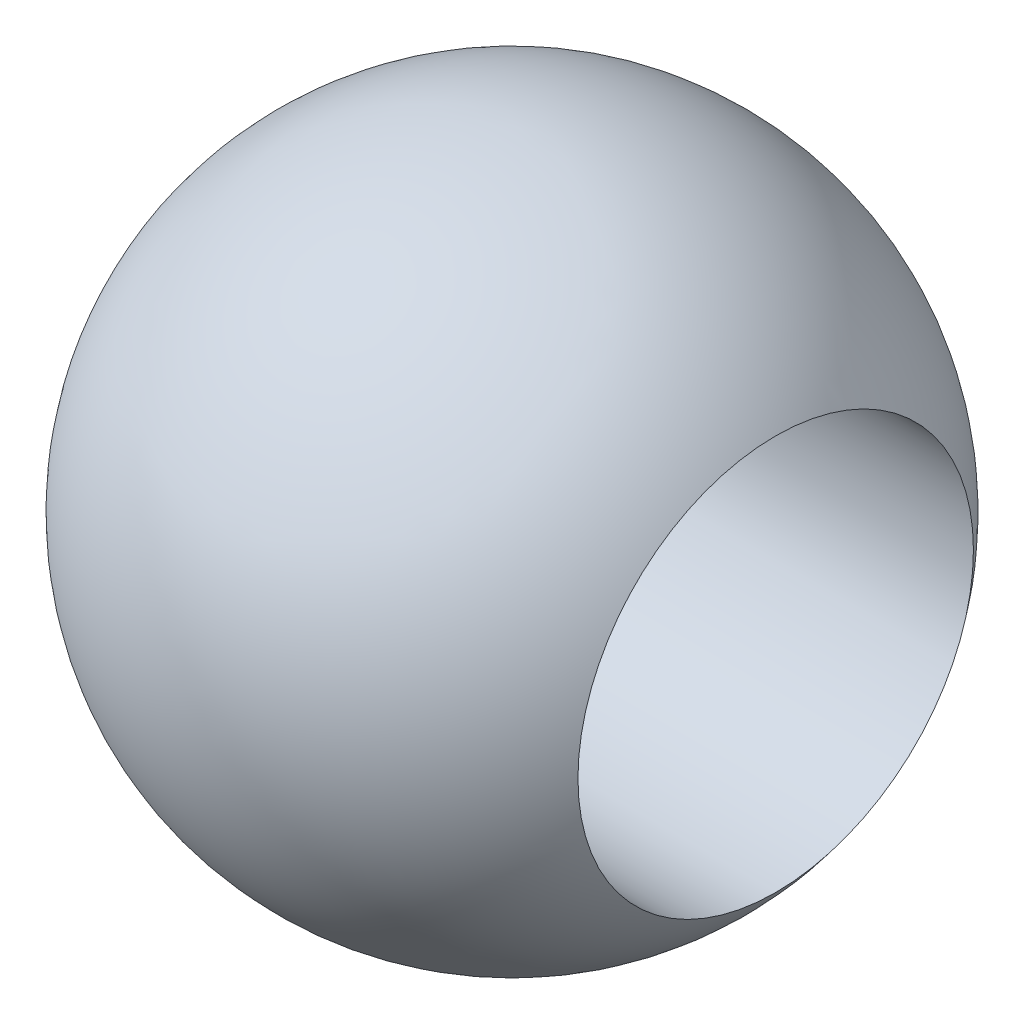
ISO-10303-21;
HEADER;
FILE_DESCRIPTION(('STEP AP214'),'2;1');
FILE_NAME('part.step','',(''),(''),'','','');
FILE_SCHEMA(('AUTOMOTIVE_DESIGN { 1 0 10303 214 1 1 1 1 }'));
ENDSEC;
DATA;
#1=APPLICATION_CONTEXT('core data for automotive mechanical design processes');
#2=APPLICATION_PROTOCOL_DEFINITION('international standard','automotive_design',2000,#1);
#3=PRODUCT_CONTEXT('',#1,'mechanical');
#4=PRODUCT('Part','Part','',(#3));
#5=PRODUCT_RELATED_PRODUCT_CATEGORY('part','',(#4));
#6=PRODUCT_DEFINITION_FORMATION('','',#4);
#7=PRODUCT_DEFINITION_CONTEXT('part definition',#1,'design');
#8=PRODUCT_DEFINITION('design','',#6,#7);
#9=PRODUCT_DEFINITION_SHAPE('','',#8);
#10=(LENGTH_UNIT() NAMED_UNIT(*) SI_UNIT(.MILLI.,.METRE.));
#11=(NAMED_UNIT(*) PLANE_ANGLE_UNIT() SI_UNIT($,.RADIAN.));
#12=(NAMED_UNIT(*) SI_UNIT($,.STERADIAN.) SOLID_ANGLE_UNIT());
#13=UNCERTAINTY_MEASURE_WITH_UNIT(LENGTH_MEASURE(1.E-05),#10,'distance_accuracy_value','');
#14=(GEOMETRIC_REPRESENTATION_CONTEXT(3) GLOBAL_UNCERTAINTY_ASSIGNED_CONTEXT((#13)) GLOBAL_UNIT_ASSIGNED_CONTEXT((#10,
#11,#12)) REPRESENTATION_CONTEXT('',''));
#15=CARTESIAN_POINT('',(0.,0.,0.));
#16=DIRECTION('',(0.,0.,1.));
#17=DIRECTION('',(1.,0.,0.));
#18=AXIS2_PLACEMENT_3D('',#15,#16,#17);
#19=CARTESIAN_POINT('',(0.,0.,0.));
#20=DIRECTION('',(-1.,0.,0.));
#21=DIRECTION('',(0.,1.,0.));
#22=AXIS2_PLACEMENT_3D('',#19,#20,#21);
#23=SPHERICAL_SURFACE('',#22,9.525);
#24=CARTESIAN_POINT('',(1.27,0.,0.));
#25=DIRECTION('',(1.,0.,0.));
#26=DIRECTION('',(0.,0.,-1.));
#27=AXIS2_PLACEMENT_3D('',#24,#25,#26);
#28=CIRCLE('',#27,9.43995365454725);
#29=CARTESIAN_POINT('',(1.27,-3.17500000000001,-8.89));
#30=VERTEX_POINT('',#29);
#31=CARTESIAN_POINT('',(1.27,3.17500000000001,-8.89));
#32=VERTEX_POINT('',#31);
#33=EDGE_CURVE('E72',#30,#32,#28,.T.);
#34=ORIENTED_EDGE('',*,*,#33,.T.);
#35=CARTESIAN_POINT('',(0.,0.,-8.89));
#36=DIRECTION('',(0.,0.,1.));
#37=DIRECTION('',(1.,0.,0.));
#38=AXIS2_PLACEMENT_3D('',#35,#36,#37);
#39=CIRCLE('',#38,3.41957965253042);
#40=CARTESIAN_POINT('',(-1.27,3.17500000000001,-8.89));
#41=VERTEX_POINT('',#40);
#42=EDGE_CURVE('E11',#32,#41,#39,.T.);
#43=ORIENTED_EDGE('',*,*,#42,.T.);
#44=CARTESIAN_POINT('',(-1.27,0.,0.));
#45=DIRECTION('',(-1.,0.,0.));
#46=DIRECTION('',(0.,0.,1.));
#47=AXIS2_PLACEMENT_3D('',#44,#45,#46);
#48=CIRCLE('',#47,9.43995365454725);
#49=CARTESIAN_POINT('',(-1.27,-3.17500000000001,-8.89));
#50=VERTEX_POINT('',#49);
#51=EDGE_CURVE('E41',#41,#50,#48,.T.);
#52=ORIENTED_EDGE('',*,*,#51,.T.);
#53=EDGE_CURVE('E48',#50,#30,#39,.T.);
#54=ORIENTED_EDGE('',*,*,#53,.T.);
#55=EDGE_LOOP('',(#34,#43,#52,#54));
#56=FACE_BOUND('',#55,.T.);
#57=CARTESIAN_POINT('',(-7.62,0.,0.));
#58=DIRECTION('',(-1.,0.,0.));
#59=DIRECTION('',(0.,0.,1.));
#60=AXIS2_PLACEMENT_3D('',#57,#58,#59);
#61=CIRCLE('',#60,5.715);
#62=CARTESIAN_POINT('',(-7.62,0.,5.715));
#63=VERTEX_POINT('',#62);
#64=EDGE_CURVE('E75',#63,#63,#61,.T.);
#65=ORIENTED_EDGE('',*,*,#64,.F.);
#66=EDGE_LOOP('',(#65));
#67=FACE_BOUND('',#66,.T.);
#68=CARTESIAN_POINT('',(7.62,0.,0.));
#69=DIRECTION('',(-1.,0.,0.));
#70=DIRECTION('',(0.,0.,1.));
#71=AXIS2_PLACEMENT_3D('',#68,#69,#70);
#72=CIRCLE('',#71,5.715);
#73=CARTESIAN_POINT('',(7.62,0.,5.715));
#74=VERTEX_POINT('',#73);
#75=EDGE_CURVE('E81',#74,#74,#72,.T.);
#76=ORIENTED_EDGE('',*,*,#75,.T.);
#77=EDGE_LOOP('',(#76));
#78=FACE_BOUND('',#77,.T.);
#79=ADVANCED_FACE('F38',(#56,#67,#78),#23,.T.);
#80=CARTESIAN_POINT('',(-7.26734429065744,0.,0.));
#81=DIRECTION('',(-1.,0.,0.));
#82=DIRECTION('',(0.,0.,1.));
#83=AXIS2_PLACEMENT_3D('',#80,#81,#82);
#84=CYLINDRICAL_SURFACE('',#83,5.715);
#85=ORIENTED_EDGE('',*,*,#75,.F.);
#86=EDGE_LOOP('',(#85));
#87=FACE_BOUND('',#86,.T.);
#88=ORIENTED_EDGE('',*,*,#64,.T.);
#89=EDGE_LOOP('',(#88));
#90=FACE_BOUND('',#89,.T.);
#91=ADVANCED_FACE('F92',(#87,#90),#84,.F.);
#92=CARTESIAN_POINT('',(-1.27,-9.525,-10.16));
#93=DIRECTION('',(-1.,0.,0.));
#94=DIRECTION('',(0.,0.,1.));
#95=AXIS2_PLACEMENT_3D('',#92,#93,#94);
#96=PLANE('',#95);
#97=DIRECTION('',(0.,1.,0.));
#98=VECTOR('',#97,1.);
#99=CARTESIAN_POINT('',(-1.27,-9.525,-8.89));
#100=LINE('',#99,#98);
#101=EDGE_CURVE('E67',#50,#41,#100,.T.);
#102=ORIENTED_EDGE('',*,*,#101,.F.);
#103=ORIENTED_EDGE('',*,*,#51,.F.);
#104=EDGE_LOOP('',(#102,#103));
#105=FACE_BOUND('',#104,.T.);
#106=ADVANCED_FACE('F98',(#105),#96,.F.);
#107=CARTESIAN_POINT('',(1.27,-9.525,-10.16));
#108=DIRECTION('',(1.,0.,0.));
#109=DIRECTION('',(0.,0.,-1.));
#110=AXIS2_PLACEMENT_3D('',#107,#108,#109);
#111=PLANE('',#110);
#112=DIRECTION('',(0.,1.,0.));
#113=VECTOR('',#112,1.);
#114=CARTESIAN_POINT('',(1.27,-9.525,-8.89));
#115=LINE('',#114,#113);
#116=EDGE_CURVE('E55',#30,#32,#115,.T.);
#117=ORIENTED_EDGE('',*,*,#116,.T.);
#118=ORIENTED_EDGE('',*,*,#33,.F.);
#119=EDGE_LOOP('',(#117,#118));
#120=FACE_BOUND('',#119,.T.);
#121=ADVANCED_FACE('F71',(#120),#111,.F.);
#122=CARTESIAN_POINT('',(-1.27,-9.525,-8.89));
#123=DIRECTION('',(0.,0.,1.));
#124=DIRECTION('',(1.,0.,0.));
#125=AXIS2_PLACEMENT_3D('',#122,#123,#124);
#126=PLANE('',#125);
#127=ORIENTED_EDGE('',*,*,#116,.F.);
#128=ORIENTED_EDGE('',*,*,#53,.F.);
#129=ORIENTED_EDGE('',*,*,#101,.T.);
#130=ORIENTED_EDGE('',*,*,#42,.F.);
#131=EDGE_LOOP('',(#127,#128,#129,#130));
#132=FACE_BOUND('',#131,.T.);
#133=ADVANCED_FACE('F66',(#132),#126,.F.);
#134=CLOSED_SHELL('',(#79,#91,#106,#121,#133));
#135=MANIFOLD_SOLID_BREP('B2',#134);
#136=ADVANCED_BREP_SHAPE_REPRESENTATION('',(#18,#135),#14);
#137=SHAPE_DEFINITION_REPRESENTATION(#9,#136);
ENDSEC;
END-ISO-10303-21;
